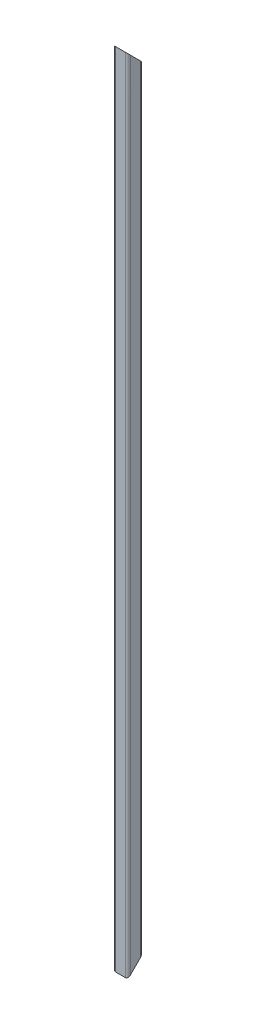
ISO-10303-21;
HEADER;
FILE_DESCRIPTION(('STEP AP214'),'2;1');
FILE_NAME('part.step','',(''),(''),'','','');
FILE_SCHEMA(('AUTOMOTIVE_DESIGN { 1 0 10303 214 1 1 1 1 }'));
ENDSEC;
DATA;
#1=APPLICATION_CONTEXT('core data for automotive mechanical design processes');
#2=APPLICATION_PROTOCOL_DEFINITION('international standard','automotive_design',2000,#1);
#3=PRODUCT_CONTEXT('',#1,'mechanical');
#4=PRODUCT('Part','Part','',(#3));
#5=PRODUCT_RELATED_PRODUCT_CATEGORY('part','',(#4));
#6=PRODUCT_DEFINITION_FORMATION('','',#4);
#7=PRODUCT_DEFINITION_CONTEXT('part definition',#1,'design');
#8=PRODUCT_DEFINITION('design','',#6,#7);
#9=PRODUCT_DEFINITION_SHAPE('','',#8);
#10=(LENGTH_UNIT() NAMED_UNIT(*) SI_UNIT(.MILLI.,.METRE.));
#11=(NAMED_UNIT(*) PLANE_ANGLE_UNIT() SI_UNIT($,.RADIAN.));
#12=(NAMED_UNIT(*) SI_UNIT($,.STERADIAN.) SOLID_ANGLE_UNIT());
#13=UNCERTAINTY_MEASURE_WITH_UNIT(LENGTH_MEASURE(1.E-05),#10,'distance_accuracy_value','');
#14=(GEOMETRIC_REPRESENTATION_CONTEXT(3) GLOBAL_UNCERTAINTY_ASSIGNED_CONTEXT((#13)) GLOBAL_UNIT_ASSIGNED_CONTEXT((#10,
#11,#12)) REPRESENTATION_CONTEXT('',''));
#15=CARTESIAN_POINT('',(0.,0.,0.));
#16=DIRECTION('',(0.,0.,1.));
#17=DIRECTION('',(1.,0.,0.));
#18=AXIS2_PLACEMENT_3D('',#15,#16,#17);
#19=CARTESIAN_POINT('',(-15.9999999999999,3240.,26.));
#20=DIRECTION('',(0.,0.,-1.));
#21=DIRECTION('',(-1.,0.,0.));
#22=AXIS2_PLACEMENT_3D('',#19,#20,#21);
#23=PLANE('',#22);
#24=DIRECTION('',(1.,0.,0.));
#25=VECTOR('',#24,1.);
#26=CARTESIAN_POINT('',(-16.0000000000005,4.00000000000045,26.));
#27=LINE('',#26,#25);
#28=CARTESIAN_POINT('',(-15.9999999999999,4.00000000000045,26.));
#29=VERTEX_POINT('',#28);
#30=CARTESIAN_POINT('',(15.9999999999999,4.00000000000044,26.));
#31=VERTEX_POINT('',#30);
#32=EDGE_CURVE('E11',#29,#31,#27,.T.);
#33=ORIENTED_EDGE('',*,*,#32,.F.);
#34=DIRECTION('',(0.,-1.,0.));
#35=VECTOR('',#34,1.);
#36=CARTESIAN_POINT('',(-15.9999999999999,3240.,26.));
#37=LINE('',#36,#35);
#38=CARTESIAN_POINT('',(-15.9999999999999,3236.,26.));
#39=VERTEX_POINT('',#38);
#40=EDGE_CURVE('E209',#39,#29,#37,.T.);
#41=ORIENTED_EDGE('',*,*,#40,.F.);
#42=DIRECTION('',(-1.,0.,0.));
#43=VECTOR('',#42,1.);
#44=CARTESIAN_POINT('',(-15.9999999999999,3236.,26.));
#45=LINE('',#44,#43);
#46=CARTESIAN_POINT('',(15.9999999999999,3236.,26.));
#47=VERTEX_POINT('',#46);
#48=EDGE_CURVE('E43',#47,#39,#45,.T.);
#49=ORIENTED_EDGE('',*,*,#48,.F.);
#50=DIRECTION('',(0.,-1.,0.));
#51=VECTOR('',#50,1.);
#52=CARTESIAN_POINT('',(15.9999999999999,3240.,26.));
#53=LINE('',#52,#51);
#54=EDGE_CURVE('E216',#47,#31,#53,.T.);
#55=ORIENTED_EDGE('',*,*,#54,.T.);
#56=EDGE_LOOP('',(#33,#41,#49,#55));
#57=FACE_BOUND('',#56,.T.);
#58=ADVANCED_FACE('F35',(#57),#23,.T.);
#59=CARTESIAN_POINT('',(-16.,3240.,16.));
#60=DIRECTION('',(0.,-1.,0.));
#61=DIRECTION('',(0.,0.,-1.));
#62=AXIS2_PLACEMENT_3D('',#59,#60,#61);
#63=CYLINDRICAL_SURFACE('',#62,10.);
#64=CARTESIAN_POINT('',(-16.,14.0000000000002,16.));
#65=DIRECTION('',(0.,0.707106781186544,0.707106781186551));
#66=DIRECTION('',(0.,-0.707106781186551,0.707106781186544));
#67=AXIS2_PLACEMENT_3D('',#64,#65,#66);
#68=ELLIPSE('',#67,14.142135623731,10.);
#69=CARTESIAN_POINT('',(-26.,14.0000000000002,15.9999999999999));
#70=VERTEX_POINT('',#69);
#71=EDGE_CURVE('E292',#70,#29,#68,.T.);
#72=ORIENTED_EDGE('',*,*,#71,.F.);
#73=DIRECTION('',(0.,-1.,0.));
#74=VECTOR('',#73,1.);
#75=CARTESIAN_POINT('',(-26.,3240.,15.9999999999999));
#76=LINE('',#75,#74);
#77=CARTESIAN_POINT('',(-26.,3226.,15.9999999999999));
#78=VERTEX_POINT('',#77);
#79=EDGE_CURVE('E211',#78,#70,#76,.T.);
#80=ORIENTED_EDGE('',*,*,#79,.F.);
#81=CARTESIAN_POINT('',(-16.,3226.,16.));
#82=DIRECTION('',(0.,-0.707106781186545,0.70710678118655));
#83=DIRECTION('',(0.,-0.70710678118655,-0.707106781186545));
#84=AXIS2_PLACEMENT_3D('',#81,#82,#83);
#85=ELLIPSE('',#84,14.142135623731,10.);
#86=EDGE_CURVE('E196',#39,#78,#85,.T.);
#87=ORIENTED_EDGE('',*,*,#86,.F.);
#88=ORIENTED_EDGE('',*,*,#40,.T.);
#89=EDGE_LOOP('',(#72,#80,#87,#88));
#90=FACE_BOUND('',#89,.T.);
#91=ADVANCED_FACE('F208',(#90),#63,.F.);
#92=CARTESIAN_POINT('',(-26.,3240.,-15.9999999999999));
#93=DIRECTION('',(1.,0.,0.));
#94=DIRECTION('',(0.,0.,-1.));
#95=AXIS2_PLACEMENT_3D('',#92,#93,#94);
#96=PLANE('',#95);
#97=DIRECTION('',(0.,-0.707106781186551,0.707106781186544));
#98=VECTOR('',#97,1.);
#99=CARTESIAN_POINT('',(-26.,1643.00000000002,-1613.));
#100=LINE('',#99,#98);
#101=CARTESIAN_POINT('',(-26.,46.0000000000005,-15.9999999999998));
#102=VERTEX_POINT('',#101);
#103=EDGE_CURVE('E294',#102,#70,#100,.T.);
#104=ORIENTED_EDGE('',*,*,#103,.F.);
#105=DIRECTION('',(0.,-1.,0.));
#106=VECTOR('',#105,1.);
#107=CARTESIAN_POINT('',(-26.,3240.,-15.9999999999999));
#108=LINE('',#107,#106);
#109=CARTESIAN_POINT('',(-26.,3194.,-15.9999999999999));
#110=VERTEX_POINT('',#109);
#111=EDGE_CURVE('E218',#110,#102,#108,.T.);
#112=ORIENTED_EDGE('',*,*,#111,.F.);
#113=DIRECTION('',(0.,-0.70710678118655,-0.707106781186545));
#114=VECTOR('',#113,1.);
#115=CARTESIAN_POINT('',(-26.,3217.,7.00000000000022));
#116=LINE('',#115,#114);
#117=EDGE_CURVE('E212',#78,#110,#116,.T.);
#118=ORIENTED_EDGE('',*,*,#117,.F.);
#119=ORIENTED_EDGE('',*,*,#79,.T.);
#120=EDGE_LOOP('',(#104,#112,#118,#119));
#121=FACE_BOUND('',#120,.T.);
#122=ADVANCED_FACE('F326',(#121),#96,.T.);
#123=CARTESIAN_POINT('',(-16.,3240.,-16.));
#124=DIRECTION('',(0.,-1.,0.));
#125=DIRECTION('',(0.,0.,-1.));
#126=AXIS2_PLACEMENT_3D('',#123,#124,#125);
#127=CYLINDRICAL_SURFACE('',#126,10.);
#128=CARTESIAN_POINT('',(-16.,46.0000000000007,-16.));
#129=DIRECTION('',(0.,0.707106781186544,0.707106781186551));
#130=DIRECTION('',(0.,-0.707106781186551,0.707106781186544));
#131=AXIS2_PLACEMENT_3D('',#128,#129,#130);
#132=ELLIPSE('',#131,14.142135623731,10.);
#133=CARTESIAN_POINT('',(-15.9999999999999,56.0000000000009,-26.));
#134=VERTEX_POINT('',#133);
#135=EDGE_CURVE('E296',#134,#102,#132,.T.);
#136=ORIENTED_EDGE('',*,*,#135,.F.);
#137=DIRECTION('',(0.,-1.,0.));
#138=VECTOR('',#137,1.);
#139=CARTESIAN_POINT('',(-15.9999999999999,3240.,-26.));
#140=LINE('',#139,#138);
#141=CARTESIAN_POINT('',(-15.9999999999999,3184.,-26.));
#142=VERTEX_POINT('',#141);
#143=EDGE_CURVE('E225',#142,#134,#140,.T.);
#144=ORIENTED_EDGE('',*,*,#143,.F.);
#145=CARTESIAN_POINT('',(-16.,3194.,-16.));
#146=DIRECTION('',(0.,-0.707106781186545,0.70710678118655));
#147=DIRECTION('',(0.,-0.70710678118655,-0.707106781186545));
#148=AXIS2_PLACEMENT_3D('',#145,#146,#147);
#149=ELLIPSE('',#148,14.142135623731,10.);
#150=EDGE_CURVE('E280',#110,#142,#149,.T.);
#151=ORIENTED_EDGE('',*,*,#150,.F.);
#152=ORIENTED_EDGE('',*,*,#111,.T.);
#153=EDGE_LOOP('',(#136,#144,#151,#152));
#154=FACE_BOUND('',#153,.T.);
#155=ADVANCED_FACE('F305',(#154),#127,.F.);
#156=CARTESIAN_POINT('',(-15.9999999999999,3240.,-26.));
#157=DIRECTION('',(0.,0.,1.));
#158=DIRECTION('',(1.,0.,0.));
#159=AXIS2_PLACEMENT_3D('',#156,#157,#158);
#160=PLANE('',#159);
#161=DIRECTION('',(-1.,0.,0.));
#162=VECTOR('',#161,1.);
#163=CARTESIAN_POINT('',(-16.0000000000005,56.0000000000005,-26.));
#164=LINE('',#163,#162);
#165=CARTESIAN_POINT('',(15.9999999999999,56.0000000000005,-26.));
#166=VERTEX_POINT('',#165);
#167=EDGE_CURVE('E251',#166,#134,#164,.T.);
#168=ORIENTED_EDGE('',*,*,#167,.F.);
#169=DIRECTION('',(0.,-1.,0.));
#170=VECTOR('',#169,1.);
#171=CARTESIAN_POINT('',(15.9999999999999,3240.,-26.));
#172=LINE('',#171,#170);
#173=CARTESIAN_POINT('',(15.9999999999999,3184.,-26.));
#174=VERTEX_POINT('',#173);
#175=EDGE_CURVE('E228',#174,#166,#172,.T.);
#176=ORIENTED_EDGE('',*,*,#175,.F.);
#177=DIRECTION('',(1.,0.,0.));
#178=VECTOR('',#177,1.);
#179=CARTESIAN_POINT('',(-15.9999999999999,3184.,-26.));
#180=LINE('',#179,#178);
#181=EDGE_CURVE('E282',#142,#174,#180,.T.);
#182=ORIENTED_EDGE('',*,*,#181,.F.);
#183=ORIENTED_EDGE('',*,*,#143,.T.);
#184=EDGE_LOOP('',(#168,#176,#182,#183));
#185=FACE_BOUND('',#184,.T.);
#186=ADVANCED_FACE('F309',(#185),#160,.T.);
#187=CARTESIAN_POINT('',(16.,3240.,-16.));
#188=DIRECTION('',(0.,-1.,0.));
#189=DIRECTION('',(0.,0.,-1.));
#190=AXIS2_PLACEMENT_3D('',#187,#188,#189);
#191=CYLINDRICAL_SURFACE('',#190,10.);
#192=CARTESIAN_POINT('',(16.,46.0000000000007,-16.));
#193=DIRECTION('',(0.,0.707106781186544,0.707106781186551));
#194=DIRECTION('',(0.,-0.707106781186551,0.707106781186544));
#195=AXIS2_PLACEMENT_3D('',#192,#193,#194);
#196=ELLIPSE('',#195,14.142135623731,10.);
#197=CARTESIAN_POINT('',(26.,46.0000000000007,-15.9999999999999));
#198=VERTEX_POINT('',#197);
#199=EDGE_CURVE('E247',#198,#166,#196,.T.);
#200=ORIENTED_EDGE('',*,*,#199,.F.);
#201=DIRECTION('',(0.,-1.,0.));
#202=VECTOR('',#201,1.);
#203=CARTESIAN_POINT('',(26.,3240.,-15.9999999999999));
#204=LINE('',#203,#202);
#205=CARTESIAN_POINT('',(26.,3194.,-15.9999999999999));
#206=VERTEX_POINT('',#205);
#207=EDGE_CURVE('E230',#206,#198,#204,.T.);
#208=ORIENTED_EDGE('',*,*,#207,.F.);
#209=CARTESIAN_POINT('',(16.,3194.,-16.));
#210=DIRECTION('',(0.,-0.707106781186545,0.70710678118655));
#211=DIRECTION('',(0.,-0.70710678118655,-0.707106781186545));
#212=AXIS2_PLACEMENT_3D('',#209,#210,#211);
#213=ELLIPSE('',#212,14.142135623731,10.);
#214=EDGE_CURVE('E284',#174,#206,#213,.T.);
#215=ORIENTED_EDGE('',*,*,#214,.F.);
#216=ORIENTED_EDGE('',*,*,#175,.T.);
#217=EDGE_LOOP('',(#200,#208,#215,#216));
#218=FACE_BOUND('',#217,.T.);
#219=ADVANCED_FACE('F312',(#218),#191,.F.);
#220=CARTESIAN_POINT('',(26.,3240.,-15.9999999999999));
#221=DIRECTION('',(-1.,0.,0.));
#222=DIRECTION('',(0.,0.,1.));
#223=AXIS2_PLACEMENT_3D('',#220,#221,#222);
#224=PLANE('',#223);
#225=DIRECTION('',(0.,0.707106781186551,-0.707106781186544));
#226=VECTOR('',#225,1.);
#227=CARTESIAN_POINT('',(26.,1643.00000000002,-1613.));
#228=LINE('',#227,#226);
#229=CARTESIAN_POINT('',(26.,14.0000000000005,15.9999999999998));
#230=VERTEX_POINT('',#229);
#231=EDGE_CURVE('E244',#230,#198,#228,.T.);
#232=ORIENTED_EDGE('',*,*,#231,.F.);
#233=DIRECTION('',(0.,-1.,0.));
#234=VECTOR('',#233,1.);
#235=CARTESIAN_POINT('',(26.,3240.,15.9999999999999));
#236=LINE('',#235,#234);
#237=CARTESIAN_POINT('',(26.,3226.,15.9999999999999));
#238=VERTEX_POINT('',#237);
#239=EDGE_CURVE('E176',#238,#230,#236,.T.);
#240=ORIENTED_EDGE('',*,*,#239,.F.);
#241=DIRECTION('',(0.,0.70710678118655,0.707106781186545));
#242=VECTOR('',#241,1.);
#243=CARTESIAN_POINT('',(26.,3217.,7.00000000000022));
#244=LINE('',#243,#242);
#245=EDGE_CURVE('E243',#206,#238,#244,.T.);
#246=ORIENTED_EDGE('',*,*,#245,.F.);
#247=ORIENTED_EDGE('',*,*,#207,.T.);
#248=EDGE_LOOP('',(#232,#240,#246,#247));
#249=FACE_BOUND('',#248,.T.);
#250=ADVANCED_FACE('F242',(#249),#224,.T.);
#251=CARTESIAN_POINT('',(16.,3240.,16.));
#252=DIRECTION('',(0.,-1.,0.));
#253=DIRECTION('',(0.,0.,-1.));
#254=AXIS2_PLACEMENT_3D('',#251,#252,#253);
#255=CYLINDRICAL_SURFACE('',#254,10.);
#256=CARTESIAN_POINT('',(16.,14.0000000000002,16.));
#257=DIRECTION('',(0.,0.707106781186544,0.707106781186551));
#258=DIRECTION('',(0.,-0.707106781186551,0.707106781186544));
#259=AXIS2_PLACEMENT_3D('',#256,#257,#258);
#260=ELLIPSE('',#259,14.142135623731,10.);
#261=EDGE_CURVE('E241',#31,#230,#260,.T.);
#262=ORIENTED_EDGE('',*,*,#261,.F.);
#263=ORIENTED_EDGE('',*,*,#54,.F.);
#264=CARTESIAN_POINT('',(16.,3226.,16.));
#265=DIRECTION('',(0.,-0.707106781186545,0.70710678118655));
#266=DIRECTION('',(0.,-0.70710678118655,-0.707106781186545));
#267=AXIS2_PLACEMENT_3D('',#264,#265,#266);
#268=ELLIPSE('',#267,14.142135623731,10.);
#269=EDGE_CURVE('E199',#238,#47,#268,.T.);
#270=ORIENTED_EDGE('',*,*,#269,.F.);
#271=ORIENTED_EDGE('',*,*,#239,.T.);
#272=EDGE_LOOP('',(#262,#263,#270,#271));
#273=FACE_BOUND('',#272,.T.);
#274=ADVANCED_FACE('F240',(#273),#255,.F.);
#275=CARTESIAN_POINT('',(-30.,3180.,-30.));
#276=DIRECTION('',(0.,-0.707106781186545,0.70710678118655));
#277=DIRECTION('',(0.,-0.70710678118655,-0.707106781186545));
#278=AXIS2_PLACEMENT_3D('',#275,#276,#277);
#279=PLANE('',#278);
#280=ORIENTED_EDGE('',*,*,#269,.T.);
#281=ORIENTED_EDGE('',*,*,#48,.T.);
#282=ORIENTED_EDGE('',*,*,#86,.T.);
#283=ORIENTED_EDGE('',*,*,#117,.T.);
#284=ORIENTED_EDGE('',*,*,#150,.T.);
#285=ORIENTED_EDGE('',*,*,#181,.T.);
#286=ORIENTED_EDGE('',*,*,#214,.T.);
#287=ORIENTED_EDGE('',*,*,#245,.T.);
#288=EDGE_LOOP('',(#280,#281,#282,#283,#284,#285,#286,#287));
#289=FACE_BOUND('',#288,.T.);
#290=DIRECTION('',(1.,0.,0.));
#291=VECTOR('',#290,1.);
#292=CARTESIAN_POINT('',(-30.,3180.,-30.));
#293=LINE('',#292,#291);
#294=CARTESIAN_POINT('',(-20.,3180.,-30.));
#295=VERTEX_POINT('',#294);
#296=CARTESIAN_POINT('',(19.9999999999999,3180.,-30.));
#297=VERTEX_POINT('',#296);
#298=EDGE_CURVE('E269',#295,#297,#293,.T.);
#299=ORIENTED_EDGE('',*,*,#298,.F.);
#300=CARTESIAN_POINT('',(-20.,3190.,-20.));
#301=DIRECTION('',(0.,-0.707106781186545,0.70710678118655));
#302=DIRECTION('',(0.,-0.70710678118655,-0.707106781186545));
#303=AXIS2_PLACEMENT_3D('',#300,#301,#302);
#304=ELLIPSE('',#303,14.142135623731,10.);
#305=CARTESIAN_POINT('',(-30.,3190.,-19.9999999999999));
#306=VERTEX_POINT('',#305);
#307=EDGE_CURVE('E155',#306,#295,#304,.T.);
#308=ORIENTED_EDGE('',*,*,#307,.F.);
#309=DIRECTION('',(0.,-0.70710678118655,-0.707106781186545));
#310=VECTOR('',#309,1.);
#311=CARTESIAN_POINT('',(-30.,3180.,-30.));
#312=LINE('',#311,#310);
#313=CARTESIAN_POINT('',(-30.,3230.,20.));
#314=VERTEX_POINT('',#313);
#315=EDGE_CURVE('E151',#314,#306,#312,.T.);
#316=ORIENTED_EDGE('',*,*,#315,.F.);
#317=CARTESIAN_POINT('',(-20.,3230.,20.));
#318=DIRECTION('',(0.,-0.707106781186545,0.70710678118655));
#319=DIRECTION('',(0.,-0.70710678118655,-0.707106781186545));
#320=AXIS2_PLACEMENT_3D('',#317,#318,#319);
#321=ELLIPSE('',#320,14.142135623731,10.);
#322=CARTESIAN_POINT('',(-20.,3240.,30.));
#323=VERTEX_POINT('',#322);
#324=EDGE_CURVE('E145',#323,#314,#321,.T.);
#325=ORIENTED_EDGE('',*,*,#324,.F.);
#326=DIRECTION('',(1.,0.,0.));
#327=VECTOR('',#326,1.);
#328=CARTESIAN_POINT('',(-19.9999999999999,3240.,30.));
#329=LINE('',#328,#327);
#330=CARTESIAN_POINT('',(20.,3240.,30.));
#331=VERTEX_POINT('',#330);
#332=EDGE_CURVE('E149',#323,#331,#329,.T.);
#333=ORIENTED_EDGE('',*,*,#332,.T.);
#334=CARTESIAN_POINT('',(20.,3230.,20.));
#335=DIRECTION('',(0.,-0.707106781186545,0.70710678118655));
#336=DIRECTION('',(0.,-0.70710678118655,-0.707106781186545));
#337=AXIS2_PLACEMENT_3D('',#334,#335,#336);
#338=ELLIPSE('',#337,14.142135623731,10.);
#339=CARTESIAN_POINT('',(30.,3230.,19.9999999999999));
#340=VERTEX_POINT('',#339);
#341=EDGE_CURVE('E50',#340,#331,#338,.T.);
#342=ORIENTED_EDGE('',*,*,#341,.F.);
#343=DIRECTION('',(0.,-0.70710678118655,-0.707106781186545));
#344=VECTOR('',#343,1.);
#345=CARTESIAN_POINT('',(30.,3180.,-30.));
#346=LINE('',#345,#344);
#347=CARTESIAN_POINT('',(30.,3190.,-19.9999999999999));
#348=VERTEX_POINT('',#347);
#349=EDGE_CURVE('E275',#340,#348,#346,.T.);
#350=ORIENTED_EDGE('',*,*,#349,.T.);
#351=CARTESIAN_POINT('',(20.,3190.,-20.));
#352=DIRECTION('',(0.,-0.707106781186545,0.70710678118655));
#353=DIRECTION('',(0.,-0.70710678118655,-0.707106781186545));
#354=AXIS2_PLACEMENT_3D('',#351,#352,#353);
#355=ELLIPSE('',#354,14.142135623731,10.);
#356=EDGE_CURVE('E290',#297,#348,#355,.T.);
#357=ORIENTED_EDGE('',*,*,#356,.F.);
#358=EDGE_LOOP('',(#299,#308,#316,#325,#333,#342,#350,#357));
#359=FACE_BOUND('',#358,.T.);
#360=ADVANCED_FACE('F147',(#289,#359),#279,.F.);
#361=CARTESIAN_POINT('',(-30.,60.0000000000006,-30.));
#362=DIRECTION('',(0.,0.707106781186544,0.707106781186551));
#363=DIRECTION('',(0.,-0.707106781186551,0.707106781186544));
#364=AXIS2_PLACEMENT_3D('',#361,#362,#363);
#365=PLANE('',#364);
#366=ORIENTED_EDGE('',*,*,#261,.T.);
#367=ORIENTED_EDGE('',*,*,#231,.T.);
#368=ORIENTED_EDGE('',*,*,#199,.T.);
#369=ORIENTED_EDGE('',*,*,#167,.T.);
#370=ORIENTED_EDGE('',*,*,#135,.T.);
#371=ORIENTED_EDGE('',*,*,#103,.T.);
#372=ORIENTED_EDGE('',*,*,#71,.T.);
#373=ORIENTED_EDGE('',*,*,#32,.T.);
#374=EDGE_LOOP('',(#366,#367,#368,#369,#370,#371,#372,#373));
#375=FACE_BOUND('',#374,.T.);
#376=DIRECTION('',(0.,-0.707106781186551,0.707106781186544));
#377=VECTOR('',#376,1.);
#378=CARTESIAN_POINT('',(30.,60.0000000000006,-30.));
#379=LINE('',#378,#377);
#380=CARTESIAN_POINT('',(30.,50.0000000000006,-20.));
#381=VERTEX_POINT('',#380);
#382=CARTESIAN_POINT('',(30.,10.0000000000002,19.9999999999999));
#383=VERTEX_POINT('',#382);
#384=EDGE_CURVE('E271',#381,#383,#379,.T.);
#385=ORIENTED_EDGE('',*,*,#384,.T.);
#386=CARTESIAN_POINT('',(20.,10.0000000000007,20.));
#387=DIRECTION('',(0.,0.707106781186544,0.707106781186551));
#388=DIRECTION('',(0.,-0.707106781186551,0.707106781186544));
#389=AXIS2_PLACEMENT_3D('',#386,#387,#388);
#390=ELLIPSE('',#389,14.142135623731,10.);
#391=CARTESIAN_POINT('',(20.,0.,30.));
#392=VERTEX_POINT('',#391);
#393=EDGE_CURVE('E249',#392,#383,#390,.T.);
#394=ORIENTED_EDGE('',*,*,#393,.F.);
#395=DIRECTION('',(1.,0.,0.));
#396=VECTOR('',#395,1.);
#397=CARTESIAN_POINT('',(-19.9999999999999,0.,30.));
#398=LINE('',#397,#396);
#399=CARTESIAN_POINT('',(-20.,0.,30.));
#400=VERTEX_POINT('',#399);
#401=EDGE_CURVE('E171',#400,#392,#398,.T.);
#402=ORIENTED_EDGE('',*,*,#401,.F.);
#403=CARTESIAN_POINT('',(-20.,10.0000000000007,20.));
#404=DIRECTION('',(0.,0.707106781186544,0.707106781186551));
#405=DIRECTION('',(0.,-0.707106781186551,0.707106781186544));
#406=AXIS2_PLACEMENT_3D('',#403,#404,#405);
#407=ELLIPSE('',#406,14.142135623731,10.);
#408=CARTESIAN_POINT('',(-30.,9.99999999999984,20.0000000000001));
#409=VERTEX_POINT('',#408);
#410=EDGE_CURVE('E161',#409,#400,#407,.T.);
#411=ORIENTED_EDGE('',*,*,#410,.F.);
#412=DIRECTION('',(0.,-0.707106781186551,0.707106781186544));
#413=VECTOR('',#412,1.);
#414=CARTESIAN_POINT('',(-30.,60.0000000000006,-30.));
#415=LINE('',#414,#413);
#416=CARTESIAN_POINT('',(-30.,50.0000000000002,-19.9999999999996));
#417=VERTEX_POINT('',#416);
#418=EDGE_CURVE('E273',#417,#409,#415,.T.);
#419=ORIENTED_EDGE('',*,*,#418,.F.);
#420=CARTESIAN_POINT('',(-20.,50.0000000000007,-20.));
#421=DIRECTION('',(0.,0.707106781186544,0.707106781186551));
#422=DIRECTION('',(0.,-0.707106781186551,0.707106781186544));
#423=AXIS2_PLACEMENT_3D('',#420,#421,#422);
#424=ELLIPSE('',#423,14.142135623731,10.);
#425=CARTESIAN_POINT('',(-20.,60.0000000000006,-30.));
#426=VERTEX_POINT('',#425);
#427=EDGE_CURVE('E258',#426,#417,#424,.T.);
#428=ORIENTED_EDGE('',*,*,#427,.F.);
#429=DIRECTION('',(1.,0.,0.));
#430=VECTOR('',#429,1.);
#431=CARTESIAN_POINT('',(-30.,60.0000000000006,-30.));
#432=LINE('',#431,#430);
#433=CARTESIAN_POINT('',(19.9999999999999,60.0000000000006,-30.));
#434=VERTEX_POINT('',#433);
#435=EDGE_CURVE('E213',#426,#434,#432,.T.);
#436=ORIENTED_EDGE('',*,*,#435,.T.);
#437=CARTESIAN_POINT('',(20.,50.0000000000007,-20.));
#438=DIRECTION('',(0.,0.707106781186544,0.707106781186551));
#439=DIRECTION('',(0.,-0.707106781186551,0.707106781186544));
#440=AXIS2_PLACEMENT_3D('',#437,#438,#439);
#441=ELLIPSE('',#440,14.142135623731,10.);
#442=EDGE_CURVE('E58',#381,#434,#441,.T.);
#443=ORIENTED_EDGE('',*,*,#442,.F.);
#444=EDGE_LOOP('',(#385,#394,#402,#411,#419,#428,#436,#443));
#445=FACE_BOUND('',#444,.T.);
#446=ADVANCED_FACE('F299',(#375,#445),#365,.F.);
#447=CARTESIAN_POINT('',(20.,3240.,-20.));
#448=DIRECTION('',(0.,-1.,0.));
#449=DIRECTION('',(0.,0.,-1.));
#450=AXIS2_PLACEMENT_3D('',#447,#448,#449);
#451=CYLINDRICAL_SURFACE('',#450,10.);
#452=DIRECTION('',(0.,-1.,0.));
#453=VECTOR('',#452,1.);
#454=CARTESIAN_POINT('',(30.,3240.,-19.9999999999999));
#455=LINE('',#454,#453);
#456=EDGE_CURVE('E170',#348,#381,#455,.T.);
#457=ORIENTED_EDGE('',*,*,#456,.T.);
#458=ORIENTED_EDGE('',*,*,#442,.T.);
#459=DIRECTION('',(0.,-1.,0.));
#460=VECTOR('',#459,1.);
#461=CARTESIAN_POINT('',(19.9999999999999,3240.,-30.));
#462=LINE('',#461,#460);
#463=EDGE_CURVE('E191',#297,#434,#462,.T.);
#464=ORIENTED_EDGE('',*,*,#463,.F.);
#465=ORIENTED_EDGE('',*,*,#356,.T.);
#466=EDGE_LOOP('',(#457,#458,#464,#465));
#467=FACE_BOUND('',#466,.T.);
#468=ADVANCED_FACE('F37',(#467),#451,.T.);
#469=CARTESIAN_POINT('',(-19.9999999999999,3240.,-30.));
#470=DIRECTION('',(0.,0.,1.));
#471=DIRECTION('',(1.,0.,0.));
#472=AXIS2_PLACEMENT_3D('',#469,#470,#471);
#473=PLANE('',#472);
#474=ORIENTED_EDGE('',*,*,#463,.T.);
#475=ORIENTED_EDGE('',*,*,#435,.F.);
#476=DIRECTION('',(0.,-1.,0.));
#477=VECTOR('',#476,1.);
#478=CARTESIAN_POINT('',(-19.9999999999999,3240.,-30.));
#479=LINE('',#478,#477);
#480=EDGE_CURVE('E188',#295,#426,#479,.T.);
#481=ORIENTED_EDGE('',*,*,#480,.F.);
#482=ORIENTED_EDGE('',*,*,#298,.T.);
#483=EDGE_LOOP('',(#474,#475,#481,#482));
#484=FACE_BOUND('',#483,.T.);
#485=ADVANCED_FACE('F267',(#484),#473,.F.);
#486=CARTESIAN_POINT('',(-20.,3240.,-20.));
#487=DIRECTION('',(0.,-1.,0.));
#488=DIRECTION('',(0.,0.,-1.));
#489=AXIS2_PLACEMENT_3D('',#486,#487,#488);
#490=CYLINDRICAL_SURFACE('',#489,10.);
#491=ORIENTED_EDGE('',*,*,#480,.T.);
#492=ORIENTED_EDGE('',*,*,#427,.T.);
#493=DIRECTION('',(0.,-1.,0.));
#494=VECTOR('',#493,1.);
#495=CARTESIAN_POINT('',(-30.,3240.,-19.9999999999999));
#496=LINE('',#495,#494);
#497=EDGE_CURVE('E185',#306,#417,#496,.T.);
#498=ORIENTED_EDGE('',*,*,#497,.F.);
#499=ORIENTED_EDGE('',*,*,#307,.T.);
#500=EDGE_LOOP('',(#491,#492,#498,#499));
#501=FACE_BOUND('',#500,.T.);
#502=ADVANCED_FACE('F393',(#501),#490,.T.);
#503=CARTESIAN_POINT('',(-30.,3240.,-19.9999999999999));
#504=DIRECTION('',(1.,0.,0.));
#505=DIRECTION('',(0.,0.,-1.));
#506=AXIS2_PLACEMENT_3D('',#503,#504,#505);
#507=PLANE('',#506);
#508=ORIENTED_EDGE('',*,*,#497,.T.);
#509=ORIENTED_EDGE('',*,*,#418,.T.);
#510=DIRECTION('',(0.,-1.,0.));
#511=VECTOR('',#510,1.);
#512=CARTESIAN_POINT('',(-30.,3240.,19.9999999999999));
#513=LINE('',#512,#511);
#514=EDGE_CURVE('E164',#314,#409,#513,.T.);
#515=ORIENTED_EDGE('',*,*,#514,.F.);
#516=ORIENTED_EDGE('',*,*,#315,.T.);
#517=EDGE_LOOP('',(#508,#509,#515,#516));
#518=FACE_BOUND('',#517,.T.);
#519=ADVANCED_FACE('F401',(#518),#507,.F.);
#520=CARTESIAN_POINT('',(-20.,3240.,20.));
#521=DIRECTION('',(0.,-1.,0.));
#522=DIRECTION('',(0.,0.,-1.));
#523=AXIS2_PLACEMENT_3D('',#520,#521,#522);
#524=CYLINDRICAL_SURFACE('',#523,10.);
#525=ORIENTED_EDGE('',*,*,#514,.T.);
#526=ORIENTED_EDGE('',*,*,#410,.T.);
#527=DIRECTION('',(0.,-1.,0.));
#528=VECTOR('',#527,1.);
#529=CARTESIAN_POINT('',(-20.,3240.,30.));
#530=LINE('',#529,#528);
#531=EDGE_CURVE('E159',#323,#400,#530,.T.);
#532=ORIENTED_EDGE('',*,*,#531,.F.);
#533=ORIENTED_EDGE('',*,*,#324,.T.);
#534=EDGE_LOOP('',(#525,#526,#532,#533));
#535=FACE_BOUND('',#534,.T.);
#536=ADVANCED_FACE('F160',(#535),#524,.T.);
#537=CARTESIAN_POINT('',(-19.9999999999999,3240.,30.));
#538=DIRECTION('',(0.,0.,-1.));
#539=DIRECTION('',(-1.,0.,0.));
#540=AXIS2_PLACEMENT_3D('',#537,#538,#539);
#541=PLANE('',#540);
#542=ORIENTED_EDGE('',*,*,#401,.T.);
#543=DIRECTION('',(0.,-1.,0.));
#544=VECTOR('',#543,1.);
#545=CARTESIAN_POINT('',(19.9999999999999,3240.,30.));
#546=LINE('',#545,#544);
#547=EDGE_CURVE('E165',#331,#392,#546,.T.);
#548=ORIENTED_EDGE('',*,*,#547,.F.);
#549=ORIENTED_EDGE('',*,*,#332,.F.);
#550=ORIENTED_EDGE('',*,*,#531,.T.);
#551=EDGE_LOOP('',(#542,#548,#549,#550));
#552=FACE_BOUND('',#551,.T.);
#553=ADVANCED_FACE('F168',(#552),#541,.F.);
#554=CARTESIAN_POINT('',(20.,3240.,20.));
#555=DIRECTION('',(0.,-1.,0.));
#556=DIRECTION('',(0.,0.,-1.));
#557=AXIS2_PLACEMENT_3D('',#554,#555,#556);
#558=CYLINDRICAL_SURFACE('',#557,10.);
#559=ORIENTED_EDGE('',*,*,#547,.T.);
#560=ORIENTED_EDGE('',*,*,#393,.T.);
#561=DIRECTION('',(0.,-1.,0.));
#562=VECTOR('',#561,1.);
#563=CARTESIAN_POINT('',(30.,3240.,19.9999999999999));
#564=LINE('',#563,#562);
#565=EDGE_CURVE('E174',#340,#383,#564,.T.);
#566=ORIENTED_EDGE('',*,*,#565,.F.);
#567=ORIENTED_EDGE('',*,*,#341,.T.);
#568=EDGE_LOOP('',(#559,#560,#566,#567));
#569=FACE_BOUND('',#568,.T.);
#570=ADVANCED_FACE('F428',(#569),#558,.T.);
#571=CARTESIAN_POINT('',(30.,3240.,-19.9999999999999));
#572=DIRECTION('',(-1.,0.,0.));
#573=DIRECTION('',(0.,0.,1.));
#574=AXIS2_PLACEMENT_3D('',#571,#572,#573);
#575=PLANE('',#574);
#576=ORIENTED_EDGE('',*,*,#565,.T.);
#577=ORIENTED_EDGE('',*,*,#384,.F.);
#578=ORIENTED_EDGE('',*,*,#456,.F.);
#579=ORIENTED_EDGE('',*,*,#349,.F.);
#580=EDGE_LOOP('',(#576,#577,#578,#579));
#581=FACE_BOUND('',#580,.T.);
#582=ADVANCED_FACE('F437',(#581),#575,.F.);
#583=CLOSED_SHELL('',(#58,#91,#122,#155,#186,#219,#250,#274,#360,#446,#468,#485,#502,#519,#536,
#553,#570,#582));
#584=MANIFOLD_SOLID_BREP('B2',#583);
#585=ADVANCED_BREP_SHAPE_REPRESENTATION('',(#18,#584),#14);
#586=SHAPE_DEFINITION_REPRESENTATION(#9,#585);
ENDSEC;
END-ISO-10303-21;
